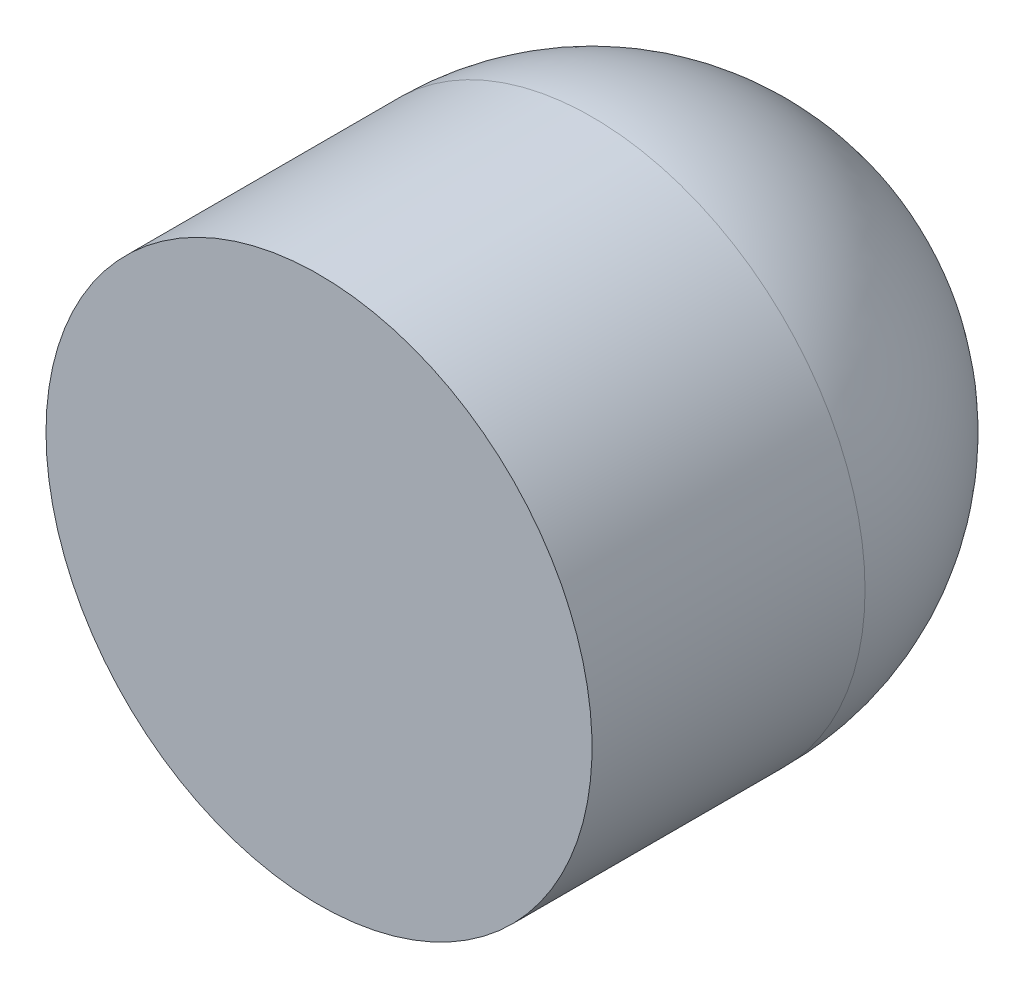
ISO-10303-21;
HEADER;
FILE_DESCRIPTION(('STEP AP214'),'2;1');
FILE_NAME('part.step','',(''),(''),'','','');
FILE_SCHEMA(('AUTOMOTIVE_DESIGN { 1 0 10303 214 1 1 1 1 }'));
ENDSEC;
DATA;
#1=APPLICATION_CONTEXT('core data for automotive mechanical design processes');
#2=APPLICATION_PROTOCOL_DEFINITION('international standard','automotive_design',2000,#1);
#3=PRODUCT_CONTEXT('',#1,'mechanical');
#4=PRODUCT('Part','Part','',(#3));
#5=PRODUCT_RELATED_PRODUCT_CATEGORY('part','',(#4));
#6=PRODUCT_DEFINITION_FORMATION('','',#4);
#7=PRODUCT_DEFINITION_CONTEXT('part definition',#1,'design');
#8=PRODUCT_DEFINITION('design','',#6,#7);
#9=PRODUCT_DEFINITION_SHAPE('','',#8);
#10=(LENGTH_UNIT() NAMED_UNIT(*) SI_UNIT(.MILLI.,.METRE.));
#11=(NAMED_UNIT(*) PLANE_ANGLE_UNIT() SI_UNIT($,.RADIAN.));
#12=(NAMED_UNIT(*) SI_UNIT($,.STERADIAN.) SOLID_ANGLE_UNIT());
#13=UNCERTAINTY_MEASURE_WITH_UNIT(LENGTH_MEASURE(1.E-05),#10,'distance_accuracy_value','');
#14=(GEOMETRIC_REPRESENTATION_CONTEXT(3) GLOBAL_UNCERTAINTY_ASSIGNED_CONTEXT((#13)) GLOBAL_UNIT_ASSIGNED_CONTEXT((#10,
#11,#12)) REPRESENTATION_CONTEXT('',''));
#15=CARTESIAN_POINT('',(0.,0.,0.));
#16=DIRECTION('',(0.,0.,1.));
#17=DIRECTION('',(1.,0.,0.));
#18=AXIS2_PLACEMENT_3D('',#15,#16,#17);
#19=CARTESIAN_POINT('',(0.,0.,10.));
#20=DIRECTION('',(0.,0.,-1.));
#21=DIRECTION('',(1.,0.,0.));
#22=AXIS2_PLACEMENT_3D('',#19,#20,#21);
#23=SPHERICAL_SURFACE('',#22,10.);
#24=CARTESIAN_POINT('',(0.,0.,10.));
#25=DIRECTION('',(0.,0.,-1.));
#26=DIRECTION('',(-1.,0.,0.));
#27=AXIS2_PLACEMENT_3D('',#24,#25,#26);
#28=CIRCLE('',#27,10.);
#29=CARTESIAN_POINT('',(-10.,0.,10.));
#30=VERTEX_POINT('',#29);
#31=EDGE_CURVE('E10',#30,#30,#28,.T.);
#32=ORIENTED_EDGE('',*,*,#31,.T.);
#33=EDGE_LOOP('',(#32));
#34=FACE_BOUND('',#33,.T.);
#35=ADVANCED_FACE('F34',(#34),#23,.T.);
#36=CARTESIAN_POINT('',(0.,0.,0.));
#37=DIRECTION('',(0.,0.,-1.));
#38=DIRECTION('',(-1.,0.,0.));
#39=AXIS2_PLACEMENT_3D('',#36,#37,#38);
#40=CYLINDRICAL_SURFACE('',#39,10.);
#41=ORIENTED_EDGE('',*,*,#31,.F.);
#42=EDGE_LOOP('',(#41));
#43=FACE_BOUND('',#42,.T.);
#44=CARTESIAN_POINT('',(0.,0.,20.));
#45=DIRECTION('',(0.,0.,-1.));
#46=DIRECTION('',(-1.,0.,0.));
#47=AXIS2_PLACEMENT_3D('',#44,#45,#46);
#48=CIRCLE('',#47,10.);
#49=CARTESIAN_POINT('',(-10.,0.,20.));
#50=VERTEX_POINT('',#49);
#51=EDGE_CURVE('E40',#50,#50,#48,.T.);
#52=ORIENTED_EDGE('',*,*,#51,.T.);
#53=EDGE_LOOP('',(#52));
#54=FACE_BOUND('',#53,.T.);
#55=ADVANCED_FACE('F46',(#43,#54),#40,.T.);
#56=CARTESIAN_POINT('',(0.,0.,20.));
#57=DIRECTION('',(0.,0.,-1.));
#58=DIRECTION('',(-1.,0.,0.));
#59=AXIS2_PLACEMENT_3D('',#56,#57,#58);
#60=PLANE('',#59);
#61=ORIENTED_EDGE('',*,*,#51,.F.);
#62=EDGE_LOOP('',(#61));
#63=FACE_BOUND('',#62,.T.);
#64=ADVANCED_FACE('F48',(#63),#60,.F.);
#65=CLOSED_SHELL('',(#35,#55,#64));
#66=MANIFOLD_SOLID_BREP('B2',#65);
#67=ADVANCED_BREP_SHAPE_REPRESENTATION('',(#18,#66),#14);
#68=SHAPE_DEFINITION_REPRESENTATION(#9,#67);
ENDSEC;
END-ISO-10303-21;
